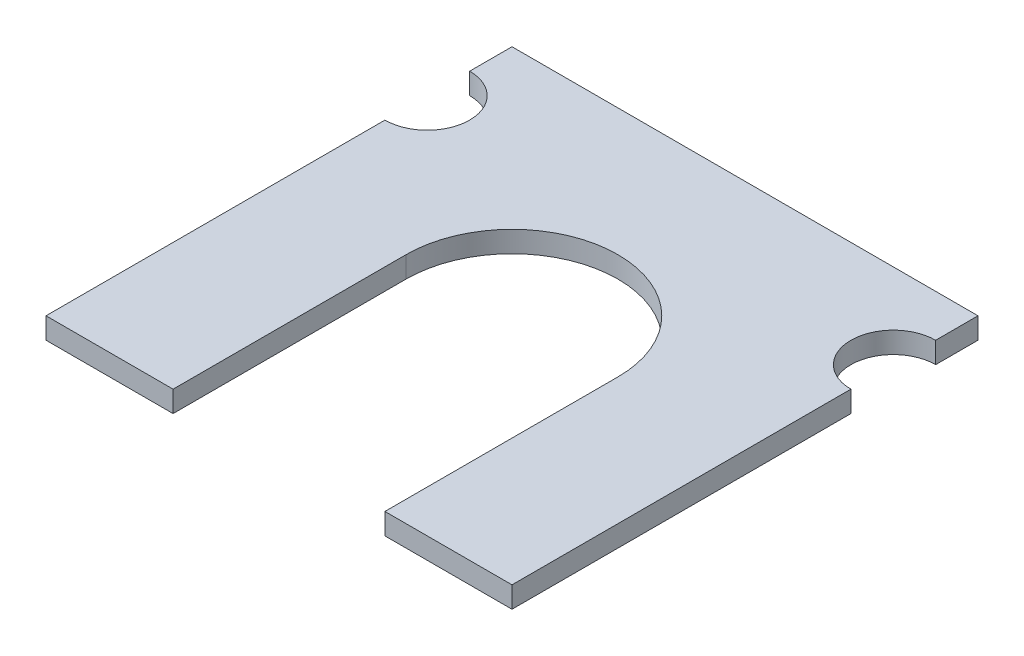
ISO-10303-21;
HEADER;
FILE_DESCRIPTION(('STEP AP214'),'2;1');
FILE_NAME('part.step','',(''),(''),'','','');
FILE_SCHEMA(('AUTOMOTIVE_DESIGN { 1 0 10303 214 1 1 1 1 }'));
ENDSEC;
DATA;
#1=APPLICATION_CONTEXT('core data for automotive mechanical design processes');
#2=APPLICATION_PROTOCOL_DEFINITION('international standard','automotive_design',2000,#1);
#3=PRODUCT_CONTEXT('',#1,'mechanical');
#4=PRODUCT('Part','Part','',(#3));
#5=PRODUCT_RELATED_PRODUCT_CATEGORY('part','',(#4));
#6=PRODUCT_DEFINITION_FORMATION('','',#4);
#7=PRODUCT_DEFINITION_CONTEXT('part definition',#1,'design');
#8=PRODUCT_DEFINITION('design','',#6,#7);
#9=PRODUCT_DEFINITION_SHAPE('','',#8);
#10=(LENGTH_UNIT() NAMED_UNIT(*) SI_UNIT(.MILLI.,.METRE.));
#11=(NAMED_UNIT(*) PLANE_ANGLE_UNIT() SI_UNIT($,.RADIAN.));
#12=(NAMED_UNIT(*) SI_UNIT($,.STERADIAN.) SOLID_ANGLE_UNIT());
#13=UNCERTAINTY_MEASURE_WITH_UNIT(LENGTH_MEASURE(1.E-05),#10,'distance_accuracy_value','');
#14=(GEOMETRIC_REPRESENTATION_CONTEXT(3) GLOBAL_UNCERTAINTY_ASSIGNED_CONTEXT((#13)) GLOBAL_UNIT_ASSIGNED_CONTEXT((#10,
#11,#12)) REPRESENTATION_CONTEXT('',''));
#15=CARTESIAN_POINT('',(0.,0.,0.));
#16=DIRECTION('',(0.,0.,1.));
#17=DIRECTION('',(1.,0.,0.));
#18=AXIS2_PLACEMENT_3D('',#15,#16,#17);
#19=CARTESIAN_POINT('',(-5.5,0.5,-5.5));
#20=DIRECTION('',(0.,0.,1.));
#21=DIRECTION('',(1.,0.,0.));
#22=AXIS2_PLACEMENT_3D('',#19,#20,#21);
#23=PLANE('',#22);
#24=DIRECTION('',(-1.,0.,0.));
#25=VECTOR('',#24,1.);
#26=CARTESIAN_POINT('',(-5.5,0.,-5.5));
#27=LINE('',#26,#25);
#28=CARTESIAN_POINT('',(5.5,0.,-5.5));
#29=VERTEX_POINT('',#28);
#30=CARTESIAN_POINT('',(-5.5,0.,-5.5));
#31=VERTEX_POINT('',#30);
#32=EDGE_CURVE('E156',#29,#31,#27,.T.);
#33=ORIENTED_EDGE('',*,*,#32,.T.);
#34=DIRECTION('',(0.,-1.,0.));
#35=VECTOR('',#34,1.);
#36=CARTESIAN_POINT('',(-5.5,0.5,-5.5));
#37=LINE('',#36,#35);
#38=CARTESIAN_POINT('',(-5.5,0.5,-5.5));
#39=VERTEX_POINT('',#38);
#40=EDGE_CURVE('E11',#39,#31,#37,.T.);
#41=ORIENTED_EDGE('',*,*,#40,.F.);
#42=DIRECTION('',(-1.,0.,0.));
#43=VECTOR('',#42,1.);
#44=CARTESIAN_POINT('',(-5.5,0.5,-5.5));
#45=LINE('',#44,#43);
#46=CARTESIAN_POINT('',(5.5,0.5,-5.5));
#47=VERTEX_POINT('',#46);
#48=EDGE_CURVE('E178',#47,#39,#45,.T.);
#49=ORIENTED_EDGE('',*,*,#48,.F.);
#50=DIRECTION('',(0.,-1.,0.));
#51=VECTOR('',#50,1.);
#52=CARTESIAN_POINT('',(5.5,0.5,-5.5));
#53=LINE('',#52,#51);
#54=EDGE_CURVE('E152',#47,#29,#53,.T.);
#55=ORIENTED_EDGE('',*,*,#54,.T.);
#56=EDGE_LOOP('',(#33,#41,#49,#55));
#57=FACE_BOUND('',#56,.T.);
#58=ADVANCED_FACE('F36',(#57),#23,.F.);
#59=CARTESIAN_POINT('',(-5.5,0.5,-5.5));
#60=DIRECTION('',(1.,0.,0.));
#61=DIRECTION('',(0.,0.,-1.));
#62=AXIS2_PLACEMENT_3D('',#59,#60,#61);
#63=PLANE('',#62);
#64=DIRECTION('',(0.,0.,1.));
#65=VECTOR('',#64,1.);
#66=CARTESIAN_POINT('',(-5.5,0.,-5.5));
#67=LINE('',#66,#65);
#68=CARTESIAN_POINT('',(-5.5,0.,-4.5));
#69=VERTEX_POINT('',#68);
#70=EDGE_CURVE('E159',#31,#69,#67,.T.);
#71=ORIENTED_EDGE('',*,*,#70,.T.);
#72=DIRECTION('',(0.,-1.,0.));
#73=VECTOR('',#72,1.);
#74=CARTESIAN_POINT('',(-5.5,0.5,-4.5));
#75=LINE('',#74,#73);
#76=CARTESIAN_POINT('',(-5.5,0.5,-4.5));
#77=VERTEX_POINT('',#76);
#78=EDGE_CURVE('E44',#77,#69,#75,.T.);
#79=ORIENTED_EDGE('',*,*,#78,.F.);
#80=DIRECTION('',(0.,0.,1.));
#81=VECTOR('',#80,1.);
#82=CARTESIAN_POINT('',(-5.5,0.5,-5.5));
#83=LINE('',#82,#81);
#84=EDGE_CURVE('E107',#39,#77,#83,.T.);
#85=ORIENTED_EDGE('',*,*,#84,.F.);
#86=ORIENTED_EDGE('',*,*,#40,.T.);
#87=EDGE_LOOP('',(#71,#79,#85,#86));
#88=FACE_BOUND('',#87,.T.);
#89=ADVANCED_FACE('F256',(#88),#63,.F.);
#90=CARTESIAN_POINT('',(-5.5,0.5,-3.5));
#91=DIRECTION('',(0.,-1.,0.));
#92=DIRECTION('',(0.,0.,-1.));
#93=AXIS2_PLACEMENT_3D('',#90,#91,#92);
#94=CYLINDRICAL_SURFACE('',#93,1.);
#95=CARTESIAN_POINT('',(-5.5,0.,-3.5));
#96=DIRECTION('',(0.,-1.,0.));
#97=DIRECTION('',(0.,0.,1.));
#98=AXIS2_PLACEMENT_3D('',#95,#96,#97);
#99=CIRCLE('',#98,1.);
#100=CARTESIAN_POINT('',(-5.5,0.,-2.5));
#101=VERTEX_POINT('',#100);
#102=EDGE_CURVE('E161',#69,#101,#99,.T.);
#103=ORIENTED_EDGE('',*,*,#102,.T.);
#104=DIRECTION('',(0.,-1.,0.));
#105=VECTOR('',#104,1.);
#106=CARTESIAN_POINT('',(-5.5,0.5,-2.5));
#107=LINE('',#106,#105);
#108=CARTESIAN_POINT('',(-5.5,0.5,-2.5));
#109=VERTEX_POINT('',#108);
#110=EDGE_CURVE('E197',#109,#101,#107,.T.);
#111=ORIENTED_EDGE('',*,*,#110,.F.);
#112=CARTESIAN_POINT('',(-5.5,0.5,-3.5));
#113=DIRECTION('',(0.,-1.,0.));
#114=DIRECTION('',(0.,0.,1.));
#115=AXIS2_PLACEMENT_3D('',#112,#113,#114);
#116=CIRCLE('',#115,1.);
#117=EDGE_CURVE('E205',#77,#109,#116,.T.);
#118=ORIENTED_EDGE('',*,*,#117,.F.);
#119=ORIENTED_EDGE('',*,*,#78,.T.);
#120=EDGE_LOOP('',(#103,#111,#118,#119));
#121=FACE_BOUND('',#120,.T.);
#122=ADVANCED_FACE('F203',(#121),#94,.F.);
#123=CARTESIAN_POINT('',(-5.5,0.5,-2.5));
#124=DIRECTION('',(1.,0.,0.));
#125=DIRECTION('',(0.,0.,-1.));
#126=AXIS2_PLACEMENT_3D('',#123,#124,#125);
#127=PLANE('',#126);
#128=DIRECTION('',(0.,0.,1.));
#129=VECTOR('',#128,1.);
#130=CARTESIAN_POINT('',(-5.5,0.,-2.5));
#131=LINE('',#130,#129);
#132=CARTESIAN_POINT('',(-5.5,0.,5.5));
#133=VERTEX_POINT('',#132);
#134=EDGE_CURVE('E163',#101,#133,#131,.T.);
#135=ORIENTED_EDGE('',*,*,#134,.T.);
#136=DIRECTION('',(0.,-1.,0.));
#137=VECTOR('',#136,1.);
#138=CARTESIAN_POINT('',(-5.5,0.5,5.5));
#139=LINE('',#138,#137);
#140=CARTESIAN_POINT('',(-5.5,0.5,5.5));
#141=VERTEX_POINT('',#140);
#142=EDGE_CURVE('E194',#141,#133,#139,.T.);
#143=ORIENTED_EDGE('',*,*,#142,.F.);
#144=DIRECTION('',(0.,0.,1.));
#145=VECTOR('',#144,1.);
#146=CARTESIAN_POINT('',(-5.5,0.5,-2.5));
#147=LINE('',#146,#145);
#148=EDGE_CURVE('E223',#109,#141,#147,.T.);
#149=ORIENTED_EDGE('',*,*,#148,.F.);
#150=ORIENTED_EDGE('',*,*,#110,.T.);
#151=EDGE_LOOP('',(#135,#143,#149,#150));
#152=FACE_BOUND('',#151,.T.);
#153=ADVANCED_FACE('F214',(#152),#127,.F.);
#154=CARTESIAN_POINT('',(-2.5,0.5,5.5));
#155=DIRECTION('',(0.,0.,-1.));
#156=DIRECTION('',(-1.,0.,0.));
#157=AXIS2_PLACEMENT_3D('',#154,#155,#156);
#158=PLANE('',#157);
#159=DIRECTION('',(1.,0.,0.));
#160=VECTOR('',#159,1.);
#161=CARTESIAN_POINT('',(-2.5,0.,5.5));
#162=LINE('',#161,#160);
#163=CARTESIAN_POINT('',(-2.5,0.,5.5));
#164=VERTEX_POINT('',#163);
#165=EDGE_CURVE('E165',#133,#164,#162,.T.);
#166=ORIENTED_EDGE('',*,*,#165,.T.);
#167=DIRECTION('',(0.,-1.,0.));
#168=VECTOR('',#167,1.);
#169=CARTESIAN_POINT('',(-2.5,0.5,5.5));
#170=LINE('',#169,#168);
#171=CARTESIAN_POINT('',(-2.5,0.5,5.5));
#172=VERTEX_POINT('',#171);
#173=EDGE_CURVE('E191',#172,#164,#170,.T.);
#174=ORIENTED_EDGE('',*,*,#173,.F.);
#175=DIRECTION('',(1.,0.,0.));
#176=VECTOR('',#175,1.);
#177=CARTESIAN_POINT('',(-2.5,0.5,5.5));
#178=LINE('',#177,#176);
#179=EDGE_CURVE('E220',#141,#172,#178,.T.);
#180=ORIENTED_EDGE('',*,*,#179,.F.);
#181=ORIENTED_EDGE('',*,*,#142,.T.);
#182=EDGE_LOOP('',(#166,#174,#180,#181));
#183=FACE_BOUND('',#182,.T.);
#184=ADVANCED_FACE('F218',(#183),#158,.F.);
#185=CARTESIAN_POINT('',(-2.5,0.5,0.));
#186=DIRECTION('',(-1.,0.,0.));
#187=DIRECTION('',(0.,0.,1.));
#188=AXIS2_PLACEMENT_3D('',#185,#186,#187);
#189=PLANE('',#188);
#190=DIRECTION('',(0.,0.,-1.));
#191=VECTOR('',#190,1.);
#192=CARTESIAN_POINT('',(-2.5,0.,0.));
#193=LINE('',#192,#191);
#194=CARTESIAN_POINT('',(-2.5,0.,0.));
#195=VERTEX_POINT('',#194);
#196=EDGE_CURVE('E167',#164,#195,#193,.T.);
#197=ORIENTED_EDGE('',*,*,#196,.T.);
#198=DIRECTION('',(0.,-1.,0.));
#199=VECTOR('',#198,1.);
#200=CARTESIAN_POINT('',(-2.5,0.5,0.));
#201=LINE('',#200,#199);
#202=CARTESIAN_POINT('',(-2.5,0.5,0.));
#203=VERTEX_POINT('',#202);
#204=EDGE_CURVE('E188',#203,#195,#201,.T.);
#205=ORIENTED_EDGE('',*,*,#204,.F.);
#206=DIRECTION('',(0.,0.,-1.));
#207=VECTOR('',#206,1.);
#208=CARTESIAN_POINT('',(-2.5,0.5,0.));
#209=LINE('',#208,#207);
#210=EDGE_CURVE('E222',#172,#203,#209,.T.);
#211=ORIENTED_EDGE('',*,*,#210,.F.);
#212=ORIENTED_EDGE('',*,*,#173,.T.);
#213=EDGE_LOOP('',(#197,#205,#211,#212));
#214=FACE_BOUND('',#213,.T.);
#215=ADVANCED_FACE('F269',(#214),#189,.F.);
#216=CARTESIAN_POINT('',(0.,0.5,0.));
#217=DIRECTION('',(0.,-1.,0.));
#218=DIRECTION('',(0.,0.,-1.));
#219=AXIS2_PLACEMENT_3D('',#216,#217,#218);
#220=CYLINDRICAL_SURFACE('',#219,2.5);
#221=CARTESIAN_POINT('',(0.,0.,0.));
#222=DIRECTION('',(0.,-1.,0.));
#223=DIRECTION('',(0.,0.,1.));
#224=AXIS2_PLACEMENT_3D('',#221,#222,#223);
#225=CIRCLE('',#224,2.5);
#226=CARTESIAN_POINT('',(2.5,0.,0.));
#227=VERTEX_POINT('',#226);
#228=EDGE_CURVE('E169',#195,#227,#225,.T.);
#229=ORIENTED_EDGE('',*,*,#228,.T.);
#230=DIRECTION('',(0.,-1.,0.));
#231=VECTOR('',#230,1.);
#232=CARTESIAN_POINT('',(2.5,0.5,0.));
#233=LINE('',#232,#231);
#234=CARTESIAN_POINT('',(2.5,0.5,0.));
#235=VERTEX_POINT('',#234);
#236=EDGE_CURVE('E185',#235,#227,#233,.T.);
#237=ORIENTED_EDGE('',*,*,#236,.F.);
#238=CARTESIAN_POINT('',(0.,0.5,0.));
#239=DIRECTION('',(0.,-1.,0.));
#240=DIRECTION('',(0.,0.,1.));
#241=AXIS2_PLACEMENT_3D('',#238,#239,#240);
#242=CIRCLE('',#241,2.5);
#243=EDGE_CURVE('E225',#203,#235,#242,.T.);
#244=ORIENTED_EDGE('',*,*,#243,.F.);
#245=ORIENTED_EDGE('',*,*,#204,.T.);
#246=EDGE_LOOP('',(#229,#237,#244,#245));
#247=FACE_BOUND('',#246,.T.);
#248=ADVANCED_FACE('F272',(#247),#220,.F.);
#249=CARTESIAN_POINT('',(2.5,0.5,0.));
#250=DIRECTION('',(1.,0.,0.));
#251=DIRECTION('',(0.,0.,-1.));
#252=AXIS2_PLACEMENT_3D('',#249,#250,#251);
#253=PLANE('',#252);
#254=DIRECTION('',(0.,0.,1.));
#255=VECTOR('',#254,1.);
#256=CARTESIAN_POINT('',(2.5,0.,0.));
#257=LINE('',#256,#255);
#258=CARTESIAN_POINT('',(2.5,0.,5.5));
#259=VERTEX_POINT('',#258);
#260=EDGE_CURVE('E171',#227,#259,#257,.T.);
#261=ORIENTED_EDGE('',*,*,#260,.T.);
#262=DIRECTION('',(0.,-1.,0.));
#263=VECTOR('',#262,1.);
#264=CARTESIAN_POINT('',(2.5,0.5,5.5));
#265=LINE('',#264,#263);
#266=CARTESIAN_POINT('',(2.5,0.5,5.5));
#267=VERTEX_POINT('',#266);
#268=EDGE_CURVE('E182',#267,#259,#265,.T.);
#269=ORIENTED_EDGE('',*,*,#268,.F.);
#270=DIRECTION('',(0.,0.,1.));
#271=VECTOR('',#270,1.);
#272=CARTESIAN_POINT('',(2.5,0.5,0.));
#273=LINE('',#272,#271);
#274=EDGE_CURVE('E231',#235,#267,#273,.T.);
#275=ORIENTED_EDGE('',*,*,#274,.F.);
#276=ORIENTED_EDGE('',*,*,#236,.T.);
#277=EDGE_LOOP('',(#261,#269,#275,#276));
#278=FACE_BOUND('',#277,.T.);
#279=ADVANCED_FACE('F237',(#278),#253,.F.);
#280=CARTESIAN_POINT('',(2.5,0.5,5.5));
#281=DIRECTION('',(0.,0.,-1.));
#282=DIRECTION('',(-1.,0.,0.));
#283=AXIS2_PLACEMENT_3D('',#280,#281,#282);
#284=PLANE('',#283);
#285=DIRECTION('',(1.,0.,0.));
#286=VECTOR('',#285,1.);
#287=CARTESIAN_POINT('',(2.5,0.,5.5));
#288=LINE('',#287,#286);
#289=CARTESIAN_POINT('',(5.5,0.,5.5));
#290=VERTEX_POINT('',#289);
#291=EDGE_CURVE('E173',#259,#290,#288,.T.);
#292=ORIENTED_EDGE('',*,*,#291,.T.);
#293=DIRECTION('',(0.,-1.,0.));
#294=VECTOR('',#293,1.);
#295=CARTESIAN_POINT('',(5.5,0.5,5.5));
#296=LINE('',#295,#294);
#297=CARTESIAN_POINT('',(5.5,0.5,5.5));
#298=VERTEX_POINT('',#297);
#299=EDGE_CURVE('E147',#298,#290,#296,.T.);
#300=ORIENTED_EDGE('',*,*,#299,.F.);
#301=DIRECTION('',(1.,0.,0.));
#302=VECTOR('',#301,1.);
#303=CARTESIAN_POINT('',(2.5,0.5,5.5));
#304=LINE('',#303,#302);
#305=EDGE_CURVE('E138',#267,#298,#304,.T.);
#306=ORIENTED_EDGE('',*,*,#305,.F.);
#307=ORIENTED_EDGE('',*,*,#268,.T.);
#308=EDGE_LOOP('',(#292,#300,#306,#307));
#309=FACE_BOUND('',#308,.T.);
#310=ADVANCED_FACE('F241',(#309),#284,.F.);
#311=CARTESIAN_POINT('',(5.5,0.5,-2.5));
#312=DIRECTION('',(-1.,0.,0.));
#313=DIRECTION('',(0.,0.,1.));
#314=AXIS2_PLACEMENT_3D('',#311,#312,#313);
#315=PLANE('',#314);
#316=DIRECTION('',(0.,0.,-1.));
#317=VECTOR('',#316,1.);
#318=CARTESIAN_POINT('',(5.5,0.,-2.5));
#319=LINE('',#318,#317);
#320=CARTESIAN_POINT('',(5.5,0.,-2.5));
#321=VERTEX_POINT('',#320);
#322=EDGE_CURVE('E146',#290,#321,#319,.T.);
#323=ORIENTED_EDGE('',*,*,#322,.T.);
#324=DIRECTION('',(0.,-1.,0.));
#325=VECTOR('',#324,1.);
#326=CARTESIAN_POINT('',(5.5,0.5,-2.5));
#327=LINE('',#326,#325);
#328=CARTESIAN_POINT('',(5.5,0.5,-2.5));
#329=VERTEX_POINT('',#328);
#330=EDGE_CURVE('E143',#329,#321,#327,.T.);
#331=ORIENTED_EDGE('',*,*,#330,.F.);
#332=DIRECTION('',(0.,0.,-1.));
#333=VECTOR('',#332,1.);
#334=CARTESIAN_POINT('',(5.5,0.5,-2.5));
#335=LINE('',#334,#333);
#336=EDGE_CURVE('E132',#298,#329,#335,.T.);
#337=ORIENTED_EDGE('',*,*,#336,.F.);
#338=ORIENTED_EDGE('',*,*,#299,.T.);
#339=EDGE_LOOP('',(#323,#331,#337,#338));
#340=FACE_BOUND('',#339,.T.);
#341=ADVANCED_FACE('F144',(#340),#315,.F.);
#342=CARTESIAN_POINT('',(5.5,0.5,-3.5));
#343=DIRECTION('',(0.,-1.,0.));
#344=DIRECTION('',(0.,0.,-1.));
#345=AXIS2_PLACEMENT_3D('',#342,#343,#344);
#346=CYLINDRICAL_SURFACE('',#345,1.);
#347=CARTESIAN_POINT('',(5.5,0.,-3.5));
#348=DIRECTION('',(0.,-1.,0.));
#349=DIRECTION('',(0.,0.,-1.));
#350=AXIS2_PLACEMENT_3D('',#347,#348,#349);
#351=CIRCLE('',#350,1.);
#352=CARTESIAN_POINT('',(5.5,0.,-4.5));
#353=VERTEX_POINT('',#352);
#354=EDGE_CURVE('E93',#321,#353,#351,.T.);
#355=ORIENTED_EDGE('',*,*,#354,.T.);
#356=DIRECTION('',(0.,-1.,0.));
#357=VECTOR('',#356,1.);
#358=CARTESIAN_POINT('',(5.5,0.5,-4.5));
#359=LINE('',#358,#357);
#360=CARTESIAN_POINT('',(5.5,0.5,-4.5));
#361=VERTEX_POINT('',#360);
#362=EDGE_CURVE('E148',#361,#353,#359,.T.);
#363=ORIENTED_EDGE('',*,*,#362,.F.);
#364=CARTESIAN_POINT('',(5.5,0.5,-3.5));
#365=DIRECTION('',(0.,-1.,0.));
#366=DIRECTION('',(0.,0.,-1.));
#367=AXIS2_PLACEMENT_3D('',#364,#365,#366);
#368=CIRCLE('',#367,1.);
#369=EDGE_CURVE('E136',#329,#361,#368,.T.);
#370=ORIENTED_EDGE('',*,*,#369,.F.);
#371=ORIENTED_EDGE('',*,*,#330,.T.);
#372=EDGE_LOOP('',(#355,#363,#370,#371));
#373=FACE_BOUND('',#372,.T.);
#374=ADVANCED_FACE('F150',(#373),#346,.F.);
#375=CARTESIAN_POINT('',(5.5,0.5,-5.5));
#376=DIRECTION('',(-1.,0.,0.));
#377=DIRECTION('',(0.,0.,1.));
#378=AXIS2_PLACEMENT_3D('',#375,#376,#377);
#379=PLANE('',#378);
#380=DIRECTION('',(0.,0.,-1.));
#381=VECTOR('',#380,1.);
#382=CARTESIAN_POINT('',(5.5,0.,-5.5));
#383=LINE('',#382,#381);
#384=EDGE_CURVE('E99',#353,#29,#383,.T.);
#385=ORIENTED_EDGE('',*,*,#384,.T.);
#386=ORIENTED_EDGE('',*,*,#54,.F.);
#387=DIRECTION('',(0.,0.,-1.));
#388=VECTOR('',#387,1.);
#389=CARTESIAN_POINT('',(5.5,0.5,-5.5));
#390=LINE('',#389,#388);
#391=EDGE_CURVE('E52',#361,#47,#390,.T.);
#392=ORIENTED_EDGE('',*,*,#391,.F.);
#393=ORIENTED_EDGE('',*,*,#362,.T.);
#394=EDGE_LOOP('',(#385,#386,#392,#393));
#395=FACE_BOUND('',#394,.T.);
#396=ADVANCED_FACE('F245',(#395),#379,.F.);
#397=CARTESIAN_POINT('',(5.5,0.5,-3.5));
#398=DIRECTION('',(0.,-1.,0.));
#399=DIRECTION('',(0.,0.,-1.));
#400=AXIS2_PLACEMENT_3D('',#397,#398,#399);
#401=PLANE('',#400);
#402=ORIENTED_EDGE('',*,*,#48,.T.);
#403=ORIENTED_EDGE('',*,*,#84,.T.);
#404=ORIENTED_EDGE('',*,*,#117,.T.);
#405=ORIENTED_EDGE('',*,*,#148,.T.);
#406=ORIENTED_EDGE('',*,*,#179,.T.);
#407=ORIENTED_EDGE('',*,*,#210,.T.);
#408=ORIENTED_EDGE('',*,*,#243,.T.);
#409=ORIENTED_EDGE('',*,*,#274,.T.);
#410=ORIENTED_EDGE('',*,*,#305,.T.);
#411=ORIENTED_EDGE('',*,*,#336,.T.);
#412=ORIENTED_EDGE('',*,*,#369,.T.);
#413=ORIENTED_EDGE('',*,*,#391,.T.);
#414=EDGE_LOOP('',(#402,#403,#404,#405,#406,#407,#408,#409,#410,#411,#412,#413));
#415=FACE_BOUND('',#414,.T.);
#416=ADVANCED_FACE('F134',(#415),#401,.F.);
#417=CARTESIAN_POINT('',(5.5,0.,-3.5));
#418=DIRECTION('',(0.,-1.,0.));
#419=DIRECTION('',(0.,0.,-1.));
#420=AXIS2_PLACEMENT_3D('',#417,#418,#419);
#421=PLANE('',#420);
#422=ORIENTED_EDGE('',*,*,#32,.F.);
#423=ORIENTED_EDGE('',*,*,#384,.F.);
#424=ORIENTED_EDGE('',*,*,#354,.F.);
#425=ORIENTED_EDGE('',*,*,#322,.F.);
#426=ORIENTED_EDGE('',*,*,#291,.F.);
#427=ORIENTED_EDGE('',*,*,#260,.F.);
#428=ORIENTED_EDGE('',*,*,#228,.F.);
#429=ORIENTED_EDGE('',*,*,#196,.F.);
#430=ORIENTED_EDGE('',*,*,#165,.F.);
#431=ORIENTED_EDGE('',*,*,#134,.F.);
#432=ORIENTED_EDGE('',*,*,#102,.F.);
#433=ORIENTED_EDGE('',*,*,#70,.F.);
#434=EDGE_LOOP('',(#422,#423,#424,#425,#426,#427,#428,#429,#430,#431,#432,#433));
#435=FACE_BOUND('',#434,.T.);
#436=ADVANCED_FACE('F209',(#435),#421,.T.);
#437=CLOSED_SHELL('',(#58,#89,#122,#153,#184,#215,#248,#279,#310,#341,#374,#396,#416,#436));
#438=MANIFOLD_SOLID_BREP('B2',#437);
#439=ADVANCED_BREP_SHAPE_REPRESENTATION('',(#18,#438),#14);
#440=SHAPE_DEFINITION_REPRESENTATION(#9,#439);
ENDSEC;
END-ISO-10303-21;
